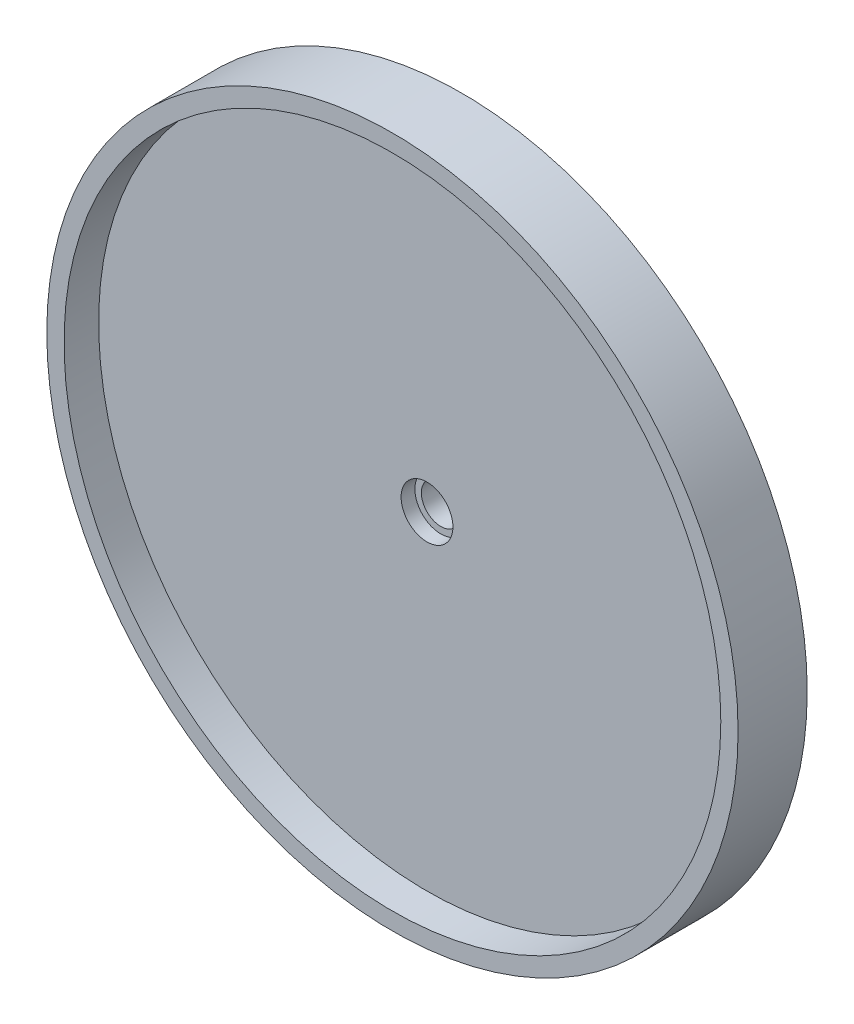
ISO-10303-21;
HEADER;
FILE_DESCRIPTION(('STEP AP214'),'2;1');
FILE_NAME('part.step','',(''),(''),'','','');
FILE_SCHEMA(('AUTOMOTIVE_DESIGN { 1 0 10303 214 1 1 1 1 }'));
ENDSEC;
DATA;
#1=APPLICATION_CONTEXT('core data for automotive mechanical design processes');
#2=APPLICATION_PROTOCOL_DEFINITION('international standard','automotive_design',2000,#1);
#3=PRODUCT_CONTEXT('',#1,'mechanical');
#4=PRODUCT('Part','Part','',(#3));
#5=PRODUCT_RELATED_PRODUCT_CATEGORY('part','',(#4));
#6=PRODUCT_DEFINITION_FORMATION('','',#4);
#7=PRODUCT_DEFINITION_CONTEXT('part definition',#1,'design');
#8=PRODUCT_DEFINITION('design','',#6,#7);
#9=PRODUCT_DEFINITION_SHAPE('','',#8);
#10=(LENGTH_UNIT() NAMED_UNIT(*) SI_UNIT(.MILLI.,.METRE.));
#11=(NAMED_UNIT(*) PLANE_ANGLE_UNIT() SI_UNIT($,.RADIAN.));
#12=(NAMED_UNIT(*) SI_UNIT($,.STERADIAN.) SOLID_ANGLE_UNIT());
#13=UNCERTAINTY_MEASURE_WITH_UNIT(LENGTH_MEASURE(1.E-05),#10,'distance_accuracy_value','');
#14=(GEOMETRIC_REPRESENTATION_CONTEXT(3) GLOBAL_UNCERTAINTY_ASSIGNED_CONTEXT((#13)) GLOBAL_UNIT_ASSIGNED_CONTEXT((#10,
#11,#12)) REPRESENTATION_CONTEXT('',''));
#15=CARTESIAN_POINT('',(0.,0.,0.));
#16=DIRECTION('',(0.,0.,1.));
#17=DIRECTION('',(1.,0.,0.));
#18=AXIS2_PLACEMENT_3D('',#15,#16,#17);
#19=CARTESIAN_POINT('',(0.,0.,-12.700012));
#20=DIRECTION('',(0.,0.,1.));
#21=DIRECTION('',(1.,0.,0.));
#22=AXIS2_PLACEMENT_3D('',#19,#20,#21);
#23=CYLINDRICAL_SURFACE('',#22,3.571875);
#24=CARTESIAN_POINT('',(0.,0.,-12.7));
#25=DIRECTION('',(0.,0.,1.));
#26=DIRECTION('',(1.,0.,0.));
#27=AXIS2_PLACEMENT_3D('',#24,#25,#26);
#28=CIRCLE('',#27,3.571875);
#29=CARTESIAN_POINT('',(3.571875,0.,-12.7));
#30=VERTEX_POINT('',#29);
#31=EDGE_CURVE('E54',#30,#30,#28,.F.);
#32=CARTESIAN_POINT('',(0.,0.,-8.89));
#33=DIRECTION('',(0.,0.,1.));
#34=DIRECTION('',(1.,0.,0.));
#35=AXIS2_PLACEMENT_3D('',#32,#33,#34);
#36=CIRCLE('',#35,3.571875);
#37=CARTESIAN_POINT('',(3.571875,0.,-8.89));
#38=VERTEX_POINT('',#37);
#39=EDGE_CURVE('E40',#38,#38,#36,.T.);
#40=CARTESIAN_POINT('',(3.571875,0.,-12.7));
#41=CARTESIAN_POINT('',(3.571875,0.,-12.6603125));
#42=CARTESIAN_POINT('',(3.571875,0.,-12.620625));
#43=CARTESIAN_POINT('',(3.571875,0.,-12.54125));
#44=CARTESIAN_POINT('',(3.571875,0.,-12.5015625));
#45=CARTESIAN_POINT('',(3.571875,0.,-12.4221875));
#46=CARTESIAN_POINT('',(3.571875,0.,-12.3825));
#47=CARTESIAN_POINT('',(3.571875,0.,-12.303125));
#48=CARTESIAN_POINT('',(3.571875,0.,-12.2634375));
#49=CARTESIAN_POINT('',(3.571875,0.,-12.1840625));
#50=CARTESIAN_POINT('',(3.571875,0.,-12.144375));
#51=CARTESIAN_POINT('',(3.571875,0.,-12.065));
#52=CARTESIAN_POINT('',(3.571875,0.,-12.0253125));
#53=CARTESIAN_POINT('',(3.571875,0.,-11.9459375));
#54=CARTESIAN_POINT('',(3.571875,0.,-11.90625));
#55=CARTESIAN_POINT('',(3.571875,0.,-11.826875));
#56=CARTESIAN_POINT('',(3.571875,0.,-11.7871875));
#57=CARTESIAN_POINT('',(3.571875,0.,-11.7078125));
#58=CARTESIAN_POINT('',(3.571875,0.,-11.668125));
#59=CARTESIAN_POINT('',(3.571875,0.,-11.58875));
#60=CARTESIAN_POINT('',(3.571875,0.,-11.5490625));
#61=CARTESIAN_POINT('',(3.571875,0.,-11.4696875));
#62=CARTESIAN_POINT('',(3.571875,0.,-11.43));
#63=CARTESIAN_POINT('',(3.571875,0.,-11.350625));
#64=CARTESIAN_POINT('',(3.571875,0.,-11.3109375));
#65=CARTESIAN_POINT('',(3.571875,0.,-11.2315625));
#66=CARTESIAN_POINT('',(3.571875,0.,-11.191875));
#67=CARTESIAN_POINT('',(3.571875,0.,-11.1125));
#68=CARTESIAN_POINT('',(3.571875,0.,-11.0728125));
#69=CARTESIAN_POINT('',(3.571875,0.,-10.9934375));
#70=CARTESIAN_POINT('',(3.571875,0.,-10.95375));
#71=CARTESIAN_POINT('',(3.571875,0.,-10.874375));
#72=CARTESIAN_POINT('',(3.571875,0.,-10.8346875));
#73=CARTESIAN_POINT('',(3.571875,0.,-10.7553125));
#74=CARTESIAN_POINT('',(3.571875,0.,-10.715625));
#75=CARTESIAN_POINT('',(3.571875,0.,-10.63625));
#76=CARTESIAN_POINT('',(3.571875,0.,-10.5965625));
#77=CARTESIAN_POINT('',(3.571875,0.,-10.5171875));
#78=CARTESIAN_POINT('',(3.571875,0.,-10.4775));
#79=CARTESIAN_POINT('',(3.571875,0.,-10.398125));
#80=CARTESIAN_POINT('',(3.571875,0.,-10.3584375));
#81=CARTESIAN_POINT('',(3.571875,0.,-10.2790625));
#82=CARTESIAN_POINT('',(3.571875,0.,-10.239375));
#83=CARTESIAN_POINT('',(3.571875,0.,-10.16));
#84=CARTESIAN_POINT('',(3.571875,0.,-10.1203125));
#85=CARTESIAN_POINT('',(3.571875,0.,-10.0409375));
#86=CARTESIAN_POINT('',(3.571875,0.,-10.00125));
#87=CARTESIAN_POINT('',(3.571875,0.,-9.921875));
#88=CARTESIAN_POINT('',(3.571875,0.,-9.8821875));
#89=CARTESIAN_POINT('',(3.571875,0.,-9.8028125));
#90=CARTESIAN_POINT('',(3.571875,0.,-9.763125));
#91=CARTESIAN_POINT('',(3.571875,0.,-9.68375));
#92=CARTESIAN_POINT('',(3.571875,0.,-9.6440625));
#93=CARTESIAN_POINT('',(3.571875,0.,-9.5646875));
#94=CARTESIAN_POINT('',(3.571875,0.,-9.525));
#95=CARTESIAN_POINT('',(3.571875,0.,-9.445625));
#96=CARTESIAN_POINT('',(3.571875,0.,-9.4059375));
#97=CARTESIAN_POINT('',(3.571875,0.,-9.3265625));
#98=CARTESIAN_POINT('',(3.571875,0.,-9.286875));
#99=CARTESIAN_POINT('',(3.571875,0.,-9.2075));
#100=CARTESIAN_POINT('',(3.571875,0.,-9.1678125));
#101=CARTESIAN_POINT('',(3.571875,0.,-9.0884375));
#102=CARTESIAN_POINT('',(3.571875,0.,-9.04875));
#103=CARTESIAN_POINT('',(3.571875,0.,-8.969375));
#104=CARTESIAN_POINT('',(3.571875,0.,-8.9296875));
#105=CARTESIAN_POINT('',(3.571875,0.,-8.89));
#106=B_SPLINE_CURVE_WITH_KNOTS('',3,(#40,#41,#42,#43,#44,#45,#46,#47,#48,#49,#50,#51,#52,#53,
#54,#55,#56,#57,#58,#59,#60,#61,#62,#63,#64,#65,#66,#67,#68,#69,#70,#71,#72,#73,#74,#75,#76,#77,
#78,#79,#80,#81,#82,#83,#84,#85,#86,#87,#88,#89,#90,#91,#92,#93,#94,#95,#96,#97,#98,#99,#100,
#101,#102,#103,#104,#105),.UNSPECIFIED.,.F.,.F.,(4,2,2,2,2,2,2,2,2,2,2,2,2,2,2,2,2,2,2,2,2,2,2,
2,2,2,2,2,2,2,2,2,4),(0.,0.119062500000001,0.238125,0.357187500000002,0.476250000000001,
0.5953125,0.714375000000001,0.833437500000001,0.9525,1.0715625,1.190625,1.3096875,1.42875,
1.5478125,1.666875,1.7859375,1.905,2.0240625,2.143125,2.2621875,2.38125,2.5003125,2.619375,
2.7384375,2.8575,2.9765625,3.095625,3.2146875,3.33375,3.4528125,3.571875,3.6909375,3.81),.UNSPECIFIED.);
#107=EDGE_CURVE('BSEAM36',#30,#38,#106,.T.);
#108=ORIENTED_EDGE('',*,*,#31,.T.);
#109=ORIENTED_EDGE('',*,*,#39,.T.);
#110=ORIENTED_EDGE('',*,*,#107,.T.);
#111=ORIENTED_EDGE('',*,*,#107,.F.);
#112=EDGE_LOOP('',(#108,#110,#109,#111));
#113=FACE_BOUND('',#112,.T.);
#114=ADVANCED_FACE('F36',(#113),#23,.F.);
#115=CARTESIAN_POINT('',(0.,0.,40.5335329341318));
#116=DIRECTION('',(0.,0.,1.));
#117=DIRECTION('',(1.,0.,0.));
#118=AXIS2_PLACEMENT_3D('',#115,#116,#117);
#119=CYLINDRICAL_SURFACE('',#118,63.5);
#120=CARTESIAN_POINT('',(0.,0.,0.));
#121=DIRECTION('',(0.,0.,1.));
#122=DIRECTION('',(1.,0.,0.));
#123=AXIS2_PLACEMENT_3D('',#120,#121,#122);
#124=CIRCLE('',#123,63.5);
#125=CARTESIAN_POINT('',(63.5,0.,0.));
#126=VERTEX_POINT('',#125);
#127=EDGE_CURVE('E10',#126,#126,#124,.T.);
#128=ORIENTED_EDGE('',*,*,#127,.F.);
#129=EDGE_LOOP('',(#128));
#130=FACE_BOUND('',#129,.T.);
#131=CARTESIAN_POINT('',(0.,0.,-12.7));
#132=DIRECTION('',(0.,0.,1.));
#133=DIRECTION('',(1.,0.,0.));
#134=AXIS2_PLACEMENT_3D('',#131,#132,#133);
#135=CIRCLE('',#134,63.5);
#136=CARTESIAN_POINT('',(63.5,0.,-12.7));
#137=VERTEX_POINT('',#136);
#138=EDGE_CURVE('E57',#137,#137,#135,.T.);
#139=ORIENTED_EDGE('',*,*,#138,.T.);
#140=EDGE_LOOP('',(#139));
#141=FACE_BOUND('',#140,.T.);
#142=ADVANCED_FACE('F38',(#130,#141),#119,.T.);
#143=CARTESIAN_POINT('',(0.,63.5,0.));
#144=DIRECTION('',(0.,0.,-1.));
#145=DIRECTION('',(-1.,0.,0.));
#146=AXIS2_PLACEMENT_3D('',#143,#144,#145);
#147=PLANE('',#146);
#148=CARTESIAN_POINT('',(0.,0.,0.));
#149=DIRECTION('',(0.,0.,1.));
#150=DIRECTION('',(1.,0.,0.));
#151=AXIS2_PLACEMENT_3D('',#148,#149,#150);
#152=CIRCLE('',#151,60.325);
#153=CARTESIAN_POINT('',(60.325,0.,0.));
#154=VERTEX_POINT('',#153);
#155=EDGE_CURVE('E45',#154,#154,#152,.T.);
#156=ORIENTED_EDGE('',*,*,#155,.F.);
#157=EDGE_LOOP('',(#156));
#158=FACE_BOUND('',#157,.T.);
#159=ORIENTED_EDGE('',*,*,#127,.T.);
#160=EDGE_LOOP('',(#159));
#161=FACE_BOUND('',#160,.T.);
#162=ADVANCED_FACE('F86',(#158,#161),#147,.F.);
#163=CARTESIAN_POINT('',(0.,0.,40.5335329341318));
#164=DIRECTION('',(0.,0.,1.));
#165=DIRECTION('',(1.,0.,0.));
#166=AXIS2_PLACEMENT_3D('',#163,#164,#165);
#167=CYLINDRICAL_SURFACE('',#166,60.325);
#168=CARTESIAN_POINT('',(0.,0.,-6.34999999999999));
#169=DIRECTION('',(0.,0.,1.));
#170=DIRECTION('',(1.,0.,0.));
#171=AXIS2_PLACEMENT_3D('',#168,#169,#170);
#172=CIRCLE('',#171,60.325);
#173=CARTESIAN_POINT('',(60.325,0.,-6.34999999999999));
#174=VERTEX_POINT('',#173);
#175=EDGE_CURVE('E51',#174,#174,#172,.T.);
#176=ORIENTED_EDGE('',*,*,#175,.F.);
#177=EDGE_LOOP('',(#176));
#178=FACE_BOUND('',#177,.T.);
#179=ORIENTED_EDGE('',*,*,#155,.T.);
#180=EDGE_LOOP('',(#179));
#181=FACE_BOUND('',#180,.T.);
#182=ADVANCED_FACE('F83',(#178,#181),#167,.F.);
#183=CARTESIAN_POINT('',(0.,60.325,-6.35));
#184=DIRECTION('',(0.,0.,-1.));
#185=DIRECTION('',(-1.,0.,0.));
#186=AXIS2_PLACEMENT_3D('',#183,#184,#185);
#187=PLANE('',#186);
#188=CARTESIAN_POINT('',(0.,0.,-6.35));
#189=DIRECTION('',(0.,0.,1.));
#190=DIRECTION('',(1.,0.,0.));
#191=AXIS2_PLACEMENT_3D('',#188,#189,#190);
#192=CIRCLE('',#191,4.7625);
#193=CARTESIAN_POINT('',(4.7625,0.,-6.35));
#194=VERTEX_POINT('',#193);
#195=EDGE_CURVE('E70',#194,#194,#192,.T.);
#196=ORIENTED_EDGE('',*,*,#195,.F.);
#197=EDGE_LOOP('',(#196));
#198=FACE_BOUND('',#197,.T.);
#199=ORIENTED_EDGE('',*,*,#175,.T.);
#200=EDGE_LOOP('',(#199));
#201=FACE_BOUND('',#200,.T.);
#202=ADVANCED_FACE('F81',(#198,#201),#187,.F.);
#203=CARTESIAN_POINT('',(0.,0.,-12.7));
#204=DIRECTION('',(0.,0.,1.));
#205=DIRECTION('',(1.,0.,0.));
#206=AXIS2_PLACEMENT_3D('',#203,#204,#205);
#207=PLANE('',#206);
#208=ORIENTED_EDGE('',*,*,#31,.F.);
#209=EDGE_LOOP('',(#208));
#210=FACE_BOUND('',#209,.T.);
#211=ORIENTED_EDGE('',*,*,#138,.F.);
#212=EDGE_LOOP('',(#211));
#213=FACE_BOUND('',#212,.T.);
#214=ADVANCED_FACE('F105',(#210,#213),#207,.F.);
#215=CARTESIAN_POINT('',(0.,0.,-8.89));
#216=DIRECTION('',(0.,0.,1.));
#217=DIRECTION('',(1.,0.,0.));
#218=AXIS2_PLACEMENT_3D('',#215,#216,#217);
#219=CYLINDRICAL_SURFACE('',#218,4.7625);
#220=CARTESIAN_POINT('',(0.,0.,-8.89));
#221=DIRECTION('',(0.,0.,1.));
#222=DIRECTION('',(1.,0.,0.));
#223=AXIS2_PLACEMENT_3D('',#220,#221,#222);
#224=CIRCLE('',#223,4.7625);
#225=CARTESIAN_POINT('',(4.7625,0.,-8.89));
#226=VERTEX_POINT('',#225);
#227=EDGE_CURVE('E65',#226,#226,#224,.T.);
#228=ORIENTED_EDGE('',*,*,#227,.F.);
#229=EDGE_LOOP('',(#228));
#230=FACE_BOUND('',#229,.T.);
#231=ORIENTED_EDGE('',*,*,#195,.T.);
#232=EDGE_LOOP('',(#231));
#233=FACE_BOUND('',#232,.T.);
#234=ADVANCED_FACE('F103',(#230,#233),#219,.F.);
#235=CARTESIAN_POINT('',(0.,0.,-8.89));
#236=DIRECTION('',(0.,0.,1.));
#237=DIRECTION('',(1.,0.,0.));
#238=AXIS2_PLACEMENT_3D('',#235,#236,#237);
#239=PLANE('',#238);
#240=ORIENTED_EDGE('',*,*,#39,.F.);
#241=EDGE_LOOP('',(#240));
#242=FACE_BOUND('',#241,.T.);
#243=ORIENTED_EDGE('',*,*,#227,.T.);
#244=EDGE_LOOP('',(#243));
#245=FACE_BOUND('',#244,.T.);
#246=ADVANCED_FACE('F116',(#242,#245),#239,.T.);
#247=CLOSED_SHELL('',(#114,#142,#162,#182,#202,#214,#234,#246));
#248=MANIFOLD_SOLID_BREP('B2',#247);
#249=ADVANCED_BREP_SHAPE_REPRESENTATION('',(#18,#248),#14);
#250=SHAPE_DEFINITION_REPRESENTATION(#9,#249);
ENDSEC;
END-ISO-10303-21;
